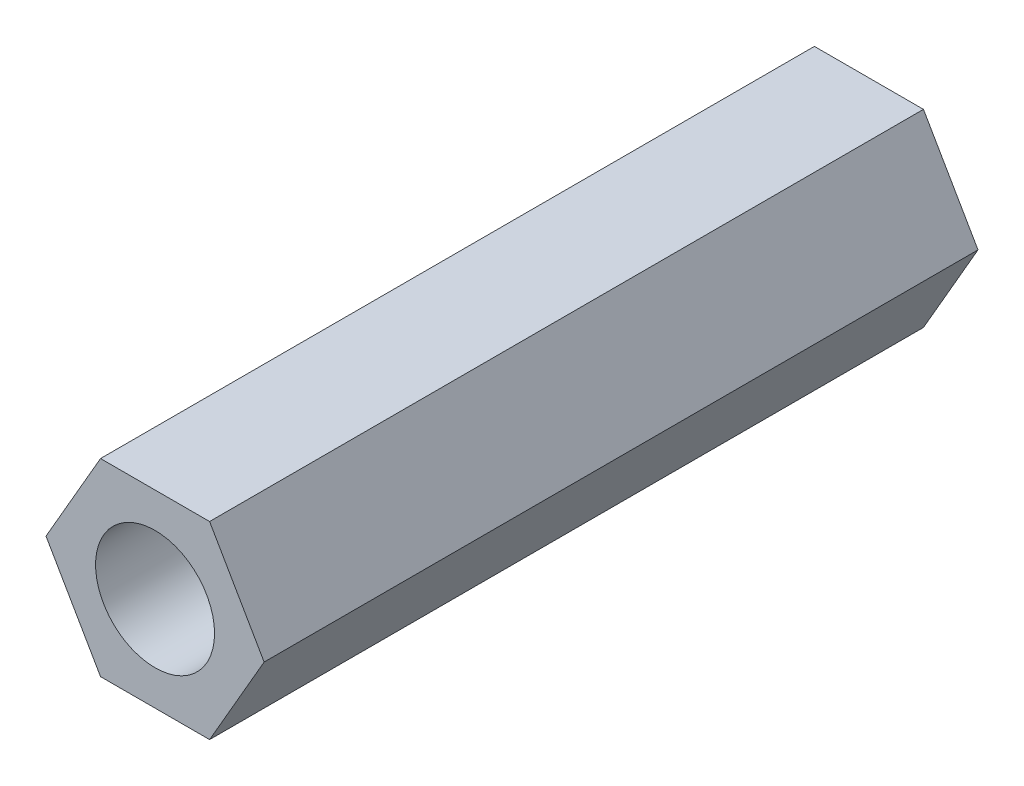
ISO-10303-21;
HEADER;
FILE_DESCRIPTION(('STEP AP214'),'2;1');
FILE_NAME('part.step','',(''),(''),'','','');
FILE_SCHEMA(('AUTOMOTIVE_DESIGN { 1 0 10303 214 1 1 1 1 }'));
ENDSEC;
DATA;
#1=APPLICATION_CONTEXT('core data for automotive mechanical design processes');
#2=APPLICATION_PROTOCOL_DEFINITION('international standard','automotive_design',2000,#1);
#3=PRODUCT_CONTEXT('',#1,'mechanical');
#4=PRODUCT('Part','Part','',(#3));
#5=PRODUCT_RELATED_PRODUCT_CATEGORY('part','',(#4));
#6=PRODUCT_DEFINITION_FORMATION('','',#4);
#7=PRODUCT_DEFINITION_CONTEXT('part definition',#1,'design');
#8=PRODUCT_DEFINITION('design','',#6,#7);
#9=PRODUCT_DEFINITION_SHAPE('','',#8);
#10=(LENGTH_UNIT() NAMED_UNIT(*) SI_UNIT(.MILLI.,.METRE.));
#11=(NAMED_UNIT(*) PLANE_ANGLE_UNIT() SI_UNIT($,.RADIAN.));
#12=(NAMED_UNIT(*) SI_UNIT($,.STERADIAN.) SOLID_ANGLE_UNIT());
#13=UNCERTAINTY_MEASURE_WITH_UNIT(LENGTH_MEASURE(1.E-05),#10,'distance_accuracy_value','');
#14=(GEOMETRIC_REPRESENTATION_CONTEXT(3) GLOBAL_UNCERTAINTY_ASSIGNED_CONTEXT((#13)) GLOBAL_UNIT_ASSIGNED_CONTEXT((#10,
#11,#12)) REPRESENTATION_CONTEXT('',''));
#15=CARTESIAN_POINT('',(0.,0.,0.));
#16=DIRECTION('',(0.,0.,1.));
#17=DIRECTION('',(1.,0.,0.));
#18=AXIS2_PLACEMENT_3D('',#15,#16,#17);
#19=CARTESIAN_POINT('',(0.,0.,18.));
#20=DIRECTION('',(0.,0.,1.));
#21=DIRECTION('',(1.,0.,0.));
#22=AXIS2_PLACEMENT_3D('',#19,#20,#21);
#23=PLANE('',#22);
#24=DIRECTION('',(-1.,0.,0.));
#25=VECTOR('',#24,1.);
#26=CARTESIAN_POINT('',(1.375,2.38156986040721,18.));
#27=LINE('',#26,#25);
#28=CARTESIAN_POINT('',(1.375,2.38156986040721,18.));
#29=VERTEX_POINT('',#28);
#30=CARTESIAN_POINT('',(-1.375,2.38156986040721,18.));
#31=VERTEX_POINT('',#30);
#32=EDGE_CURVE('E146',#29,#31,#27,.T.);
#33=ORIENTED_EDGE('',*,*,#32,.T.);
#34=DIRECTION('',(-0.5,-0.866025403784439,0.));
#35=VECTOR('',#34,1.);
#36=CARTESIAN_POINT('',(-1.375,2.38156986040721,18.));
#37=LINE('',#36,#35);
#38=CARTESIAN_POINT('',(-2.75,0.,18.));
#39=VERTEX_POINT('',#38);
#40=EDGE_CURVE('E94',#31,#39,#37,.T.);
#41=ORIENTED_EDGE('',*,*,#40,.T.);
#42=DIRECTION('',(0.5,-0.866025403784439,0.));
#43=VECTOR('',#42,1.);
#44=CARTESIAN_POINT('',(-2.75,0.,18.));
#45=LINE('',#44,#43);
#46=CARTESIAN_POINT('',(-1.375,-2.38156986040721,18.));
#47=VERTEX_POINT('',#46);
#48=EDGE_CURVE('E107',#39,#47,#45,.T.);
#49=ORIENTED_EDGE('',*,*,#48,.T.);
#50=DIRECTION('',(1.,0.,0.));
#51=VECTOR('',#50,1.);
#52=CARTESIAN_POINT('',(-1.375,-2.38156986040721,18.));
#53=LINE('',#52,#51);
#54=CARTESIAN_POINT('',(1.375,-2.38156986040721,18.));
#55=VERTEX_POINT('',#54);
#56=EDGE_CURVE('E101',#47,#55,#53,.T.);
#57=ORIENTED_EDGE('',*,*,#56,.T.);
#58=DIRECTION('',(0.5,0.866025403784439,0.));
#59=VECTOR('',#58,1.);
#60=CARTESIAN_POINT('',(1.375,-2.38156986040721,18.));
#61=LINE('',#60,#59);
#62=CARTESIAN_POINT('',(2.75,0.,18.));
#63=VERTEX_POINT('',#62);
#64=EDGE_CURVE('E105',#55,#63,#61,.T.);
#65=ORIENTED_EDGE('',*,*,#64,.T.);
#66=DIRECTION('',(-0.5,0.866025403784438,0.));
#67=VECTOR('',#66,1.);
#68=CARTESIAN_POINT('',(2.75,0.,18.));
#69=LINE('',#68,#67);
#70=EDGE_CURVE('E57',#63,#29,#69,.T.);
#71=ORIENTED_EDGE('',*,*,#70,.T.);
#72=EDGE_LOOP('',(#33,#41,#49,#57,#65,#71));
#73=FACE_BOUND('',#72,.T.);
#74=CARTESIAN_POINT('',(0.,0.,18.));
#75=DIRECTION('',(0.,0.,1.));
#76=DIRECTION('',(1.,0.,0.));
#77=AXIS2_PLACEMENT_3D('',#74,#75,#76);
#78=CIRCLE('',#77,1.5);
#79=CARTESIAN_POINT('',(1.5,0.,18.));
#80=VERTEX_POINT('',#79);
#81=EDGE_CURVE('E134',#80,#80,#78,.T.);
#82=ORIENTED_EDGE('',*,*,#81,.F.);
#83=EDGE_LOOP('',(#82));
#84=FACE_BOUND('',#83,.T.);
#85=ADVANCED_FACE('F39',(#73,#84),#23,.T.);
#86=CARTESIAN_POINT('',(0.,0.,0.));
#87=DIRECTION('',(0.,0.,1.));
#88=DIRECTION('',(1.,0.,0.));
#89=AXIS2_PLACEMENT_3D('',#86,#87,#88);
#90=PLANE('',#89);
#91=DIRECTION('',(-1.,0.,0.));
#92=VECTOR('',#91,1.);
#93=CARTESIAN_POINT('',(1.375,2.38156986040721,0.));
#94=LINE('',#93,#92);
#95=CARTESIAN_POINT('',(1.375,2.38156986040721,0.));
#96=VERTEX_POINT('',#95);
#97=CARTESIAN_POINT('',(-1.375,2.38156986040721,0.));
#98=VERTEX_POINT('',#97);
#99=EDGE_CURVE('E129',#96,#98,#94,.T.);
#100=ORIENTED_EDGE('',*,*,#99,.F.);
#101=DIRECTION('',(-0.5,0.866025403784438,0.));
#102=VECTOR('',#101,1.);
#103=CARTESIAN_POINT('',(2.75,0.,0.));
#104=LINE('',#103,#102);
#105=CARTESIAN_POINT('',(2.75,0.,0.));
#106=VERTEX_POINT('',#105);
#107=EDGE_CURVE('E86',#106,#96,#104,.T.);
#108=ORIENTED_EDGE('',*,*,#107,.F.);
#109=DIRECTION('',(0.5,0.866025403784439,0.));
#110=VECTOR('',#109,1.);
#111=CARTESIAN_POINT('',(1.375,-2.38156986040721,0.));
#112=LINE('',#111,#110);
#113=CARTESIAN_POINT('',(1.375,-2.38156986040721,0.));
#114=VERTEX_POINT('',#113);
#115=EDGE_CURVE('E80',#114,#106,#112,.T.);
#116=ORIENTED_EDGE('',*,*,#115,.F.);
#117=DIRECTION('',(1.,0.,0.));
#118=VECTOR('',#117,1.);
#119=CARTESIAN_POINT('',(-1.375,-2.38156986040721,0.));
#120=LINE('',#119,#118);
#121=CARTESIAN_POINT('',(-1.375,-2.38156986040721,0.));
#122=VERTEX_POINT('',#121);
#123=EDGE_CURVE('E116',#122,#114,#120,.T.);
#124=ORIENTED_EDGE('',*,*,#123,.F.);
#125=DIRECTION('',(0.5,-0.866025403784439,0.));
#126=VECTOR('',#125,1.);
#127=CARTESIAN_POINT('',(-2.75,0.,0.));
#128=LINE('',#127,#126);
#129=CARTESIAN_POINT('',(-2.75,0.,0.));
#130=VERTEX_POINT('',#129);
#131=EDGE_CURVE('E137',#130,#122,#128,.T.);
#132=ORIENTED_EDGE('',*,*,#131,.F.);
#133=DIRECTION('',(-0.5,-0.866025403784439,0.));
#134=VECTOR('',#133,1.);
#135=CARTESIAN_POINT('',(-1.375,2.38156986040721,0.));
#136=LINE('',#135,#134);
#137=EDGE_CURVE('E133',#98,#130,#136,.T.);
#138=ORIENTED_EDGE('',*,*,#137,.F.);
#139=EDGE_LOOP('',(#100,#108,#116,#124,#132,#138));
#140=FACE_BOUND('',#139,.T.);
#141=CARTESIAN_POINT('',(0.,0.,0.));
#142=DIRECTION('',(0.,0.,1.));
#143=DIRECTION('',(1.,0.,0.));
#144=AXIS2_PLACEMENT_3D('',#141,#142,#143);
#145=CIRCLE('',#144,1.5);
#146=CARTESIAN_POINT('',(1.5,0.,0.));
#147=VERTEX_POINT('',#146);
#148=EDGE_CURVE('E243',#147,#147,#145,.T.);
#149=ORIENTED_EDGE('',*,*,#148,.T.);
#150=EDGE_LOOP('',(#149));
#151=FACE_BOUND('',#150,.T.);
#152=ADVANCED_FACE('F159',(#140,#151),#90,.F.);
#153=CARTESIAN_POINT('',(1.375,2.38156986040721,18.));
#154=DIRECTION('',(0.,-1.,0.));
#155=DIRECTION('',(0.,0.,-1.));
#156=AXIS2_PLACEMENT_3D('',#153,#154,#155);
#157=PLANE('',#156);
#158=ORIENTED_EDGE('',*,*,#99,.T.);
#159=DIRECTION('',(0.,0.,-1.));
#160=VECTOR('',#159,1.);
#161=CARTESIAN_POINT('',(-1.375,2.38156986040721,18.));
#162=LINE('',#161,#160);
#163=EDGE_CURVE('E11',#31,#98,#162,.T.);
#164=ORIENTED_EDGE('',*,*,#163,.F.);
#165=ORIENTED_EDGE('',*,*,#32,.F.);
#166=DIRECTION('',(0.,0.,-1.));
#167=VECTOR('',#166,1.);
#168=CARTESIAN_POINT('',(1.375,2.38156986040721,18.));
#169=LINE('',#168,#167);
#170=EDGE_CURVE('E125',#29,#96,#169,.T.);
#171=ORIENTED_EDGE('',*,*,#170,.T.);
#172=EDGE_LOOP('',(#158,#164,#165,#171));
#173=FACE_BOUND('',#172,.T.);
#174=ADVANCED_FACE('F41',(#173),#157,.F.);
#175=CARTESIAN_POINT('',(-1.375,2.38156986040721,18.));
#176=DIRECTION('',(0.866025403784439,-0.5,0.));
#177=DIRECTION('',(0.5,0.866025403784439,0.));
#178=AXIS2_PLACEMENT_3D('',#175,#176,#177);
#179=PLANE('',#178);
#180=ORIENTED_EDGE('',*,*,#137,.T.);
#181=DIRECTION('',(0.,0.,-1.));
#182=VECTOR('',#181,1.);
#183=CARTESIAN_POINT('',(-2.75,0.,18.));
#184=LINE('',#183,#182);
#185=EDGE_CURVE('E49',#39,#130,#184,.T.);
#186=ORIENTED_EDGE('',*,*,#185,.F.);
#187=ORIENTED_EDGE('',*,*,#40,.F.);
#188=ORIENTED_EDGE('',*,*,#163,.T.);
#189=EDGE_LOOP('',(#180,#186,#187,#188));
#190=FACE_BOUND('',#189,.T.);
#191=ADVANCED_FACE('F184',(#190),#179,.F.);
#192=CARTESIAN_POINT('',(-2.75,0.,18.));
#193=DIRECTION('',(0.866025403784438,0.5,0.));
#194=DIRECTION('',(-0.5,0.866025403784439,0.));
#195=AXIS2_PLACEMENT_3D('',#192,#193,#194);
#196=PLANE('',#195);
#197=ORIENTED_EDGE('',*,*,#131,.T.);
#198=DIRECTION('',(0.,0.,-1.));
#199=VECTOR('',#198,1.);
#200=CARTESIAN_POINT('',(-1.375,-2.38156986040721,18.));
#201=LINE('',#200,#199);
#202=EDGE_CURVE('E118',#47,#122,#201,.T.);
#203=ORIENTED_EDGE('',*,*,#202,.F.);
#204=ORIENTED_EDGE('',*,*,#48,.F.);
#205=ORIENTED_EDGE('',*,*,#185,.T.);
#206=EDGE_LOOP('',(#197,#203,#204,#205));
#207=FACE_BOUND('',#206,.T.);
#208=ADVANCED_FACE('F156',(#207),#196,.F.);
#209=CARTESIAN_POINT('',(-1.375,-2.38156986040721,18.));
#210=DIRECTION('',(0.,1.,0.));
#211=DIRECTION('',(-1.,0.,0.));
#212=AXIS2_PLACEMENT_3D('',#209,#210,#211);
#213=PLANE('',#212);
#214=ORIENTED_EDGE('',*,*,#123,.T.);
#215=DIRECTION('',(0.,0.,-1.));
#216=VECTOR('',#215,1.);
#217=CARTESIAN_POINT('',(1.375,-2.38156986040721,18.));
#218=LINE('',#217,#216);
#219=EDGE_CURVE('E113',#55,#114,#218,.T.);
#220=ORIENTED_EDGE('',*,*,#219,.F.);
#221=ORIENTED_EDGE('',*,*,#56,.F.);
#222=ORIENTED_EDGE('',*,*,#202,.T.);
#223=EDGE_LOOP('',(#214,#220,#221,#222));
#224=FACE_BOUND('',#223,.T.);
#225=ADVANCED_FACE('F114',(#224),#213,.F.);
#226=CARTESIAN_POINT('',(1.375,-2.38156986040721,18.));
#227=DIRECTION('',(-0.866025403784439,0.5,0.));
#228=DIRECTION('',(-0.5,-0.866025403784439,0.));
#229=AXIS2_PLACEMENT_3D('',#226,#227,#228);
#230=PLANE('',#229);
#231=ORIENTED_EDGE('',*,*,#115,.T.);
#232=DIRECTION('',(0.,0.,-1.));
#233=VECTOR('',#232,1.);
#234=CARTESIAN_POINT('',(2.75,0.,18.));
#235=LINE('',#234,#233);
#236=EDGE_CURVE('E119',#63,#106,#235,.T.);
#237=ORIENTED_EDGE('',*,*,#236,.F.);
#238=ORIENTED_EDGE('',*,*,#64,.F.);
#239=ORIENTED_EDGE('',*,*,#219,.T.);
#240=EDGE_LOOP('',(#231,#237,#238,#239));
#241=FACE_BOUND('',#240,.T.);
#242=ADVANCED_FACE('F121',(#241),#230,.F.);
#243=CARTESIAN_POINT('',(2.75,0.,18.));
#244=DIRECTION('',(-0.866025403784438,-0.5,0.));
#245=DIRECTION('',(0.5,-0.866025403784439,0.));
#246=AXIS2_PLACEMENT_3D('',#243,#244,#245);
#247=PLANE('',#246);
#248=ORIENTED_EDGE('',*,*,#107,.T.);
#249=ORIENTED_EDGE('',*,*,#170,.F.);
#250=ORIENTED_EDGE('',*,*,#70,.F.);
#251=ORIENTED_EDGE('',*,*,#236,.T.);
#252=EDGE_LOOP('',(#248,#249,#250,#251));
#253=FACE_BOUND('',#252,.T.);
#254=ADVANCED_FACE('F164',(#253),#247,.F.);
#255=CARTESIAN_POINT('',(0.,0.,18.));
#256=DIRECTION('',(0.,0.,-1.));
#257=DIRECTION('',(-1.,0.,0.));
#258=AXIS2_PLACEMENT_3D('',#255,#256,#257);
#259=CYLINDRICAL_SURFACE('',#258,1.5);
#260=ORIENTED_EDGE('',*,*,#81,.T.);
#261=EDGE_LOOP('',(#260));
#262=FACE_BOUND('',#261,.T.);
#263=ORIENTED_EDGE('',*,*,#148,.F.);
#264=EDGE_LOOP('',(#263));
#265=FACE_BOUND('',#264,.T.);
#266=ADVANCED_FACE('F166',(#262,#265),#259,.F.);
#267=CLOSED_SHELL('',(#85,#152,#174,#191,#208,#225,#242,#254,#266));
#268=MANIFOLD_SOLID_BREP('B2',#267);
#269=ADVANCED_BREP_SHAPE_REPRESENTATION('',(#18,#268),#14);
#270=SHAPE_DEFINITION_REPRESENTATION(#9,#269);
ENDSEC;
END-ISO-10303-21;
